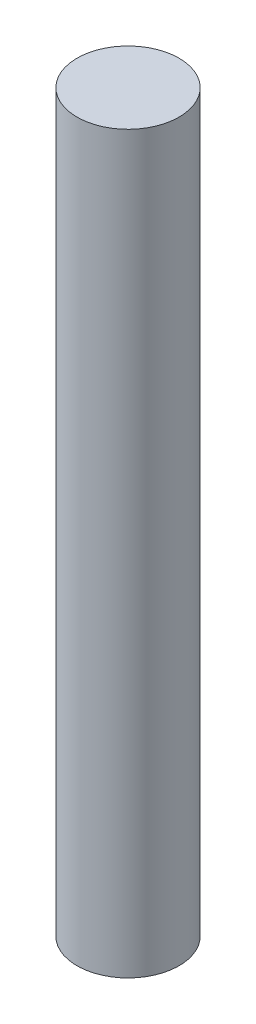
ISO-10303-21;
HEADER;
FILE_DESCRIPTION(('STEP AP214'),'2;1');
FILE_NAME('part.step','',(''),(''),'','','');
FILE_SCHEMA(('AUTOMOTIVE_DESIGN { 1 0 10303 214 1 1 1 1 }'));
ENDSEC;
DATA;
#1=APPLICATION_CONTEXT('core data for automotive mechanical design processes');
#2=APPLICATION_PROTOCOL_DEFINITION('international standard','automotive_design',2000,#1);
#3=PRODUCT_CONTEXT('',#1,'mechanical');
#4=PRODUCT('Part','Part','',(#3));
#5=PRODUCT_RELATED_PRODUCT_CATEGORY('part','',(#4));
#6=PRODUCT_DEFINITION_FORMATION('','',#4);
#7=PRODUCT_DEFINITION_CONTEXT('part definition',#1,'design');
#8=PRODUCT_DEFINITION('design','',#6,#7);
#9=PRODUCT_DEFINITION_SHAPE('','',#8);
#10=(LENGTH_UNIT() NAMED_UNIT(*) SI_UNIT(.MILLI.,.METRE.));
#11=(NAMED_UNIT(*) PLANE_ANGLE_UNIT() SI_UNIT($,.RADIAN.));
#12=(NAMED_UNIT(*) SI_UNIT($,.STERADIAN.) SOLID_ANGLE_UNIT());
#13=UNCERTAINTY_MEASURE_WITH_UNIT(LENGTH_MEASURE(1.E-05),#10,'distance_accuracy_value','');
#14=(GEOMETRIC_REPRESENTATION_CONTEXT(3) GLOBAL_UNCERTAINTY_ASSIGNED_CONTEXT((#13)) GLOBAL_UNIT_ASSIGNED_CONTEXT((#10,
#11,#12)) REPRESENTATION_CONTEXT('',''));
#15=CARTESIAN_POINT('',(0.,0.,0.));
#16=DIRECTION('',(0.,0.,1.));
#17=DIRECTION('',(1.,0.,0.));
#18=AXIS2_PLACEMENT_3D('',#15,#16,#17);
#19=CARTESIAN_POINT('',(0.,36.,0.));
#20=DIRECTION('',(0.,1.,0.));
#21=DIRECTION('',(0.,0.,1.));
#22=AXIS2_PLACEMENT_3D('',#19,#20,#21);
#23=PLANE('',#22);
#24=CARTESIAN_POINT('',(0.,36.,0.));
#25=DIRECTION('',(0.,-1.,0.));
#26=DIRECTION('',(0.,0.,-1.));
#27=AXIS2_PLACEMENT_3D('',#24,#25,#26);
#28=CIRCLE('',#27,2.5);
#29=CARTESIAN_POINT('',(0.,36.,-2.5));
#30=VERTEX_POINT('',#29);
#31=EDGE_CURVE('E18',#30,#30,#28,.T.);
#32=ORIENTED_EDGE('',*,*,#31,.F.);
#33=EDGE_LOOP('',(#32));
#34=FACE_BOUND('',#33,.T.);
#35=ADVANCED_FACE('F15',(#34),#23,.T.);
#36=CARTESIAN_POINT('',(0.,0.,0.));
#37=DIRECTION('',(0.,1.,0.));
#38=DIRECTION('',(0.,0.,1.));
#39=AXIS2_PLACEMENT_3D('',#36,#37,#38);
#40=PLANE('',#39);
#41=CARTESIAN_POINT('',(0.,0.,0.));
#42=DIRECTION('',(0.,-1.,0.));
#43=DIRECTION('',(0.,0.,-1.));
#44=AXIS2_PLACEMENT_3D('',#41,#42,#43);
#45=CIRCLE('',#44,2.5);
#46=CARTESIAN_POINT('',(0.,0.,-2.5));
#47=VERTEX_POINT('',#46);
#48=EDGE_CURVE('E10',#47,#47,#45,.F.);
#49=ORIENTED_EDGE('',*,*,#48,.F.);
#50=EDGE_LOOP('',(#49));
#51=FACE_BOUND('',#50,.T.);
#52=ADVANCED_FACE('F30',(#51),#40,.F.);
#53=CARTESIAN_POINT('',(0.,36.,0.));
#54=DIRECTION('',(0.,-1.,0.));
#55=DIRECTION('',(0.,0.,-1.));
#56=AXIS2_PLACEMENT_3D('',#53,#54,#55);
#57=CYLINDRICAL_SURFACE('',#56,2.5);
#58=ORIENTED_EDGE('',*,*,#48,.T.);
#59=EDGE_LOOP('',(#58));
#60=FACE_BOUND('',#59,.T.);
#61=ORIENTED_EDGE('',*,*,#31,.T.);
#62=EDGE_LOOP('',(#61));
#63=FACE_BOUND('',#62,.T.);
#64=ADVANCED_FACE('F27',(#60,#63),#57,.T.);
#65=CLOSED_SHELL('',(#35,#52,#64));
#66=MANIFOLD_SOLID_BREP('B1',#65);
#67=ADVANCED_BREP_SHAPE_REPRESENTATION('',(#18,#66),#14);
#68=SHAPE_DEFINITION_REPRESENTATION(#9,#67);
ENDSEC;
END-ISO-10303-21;
